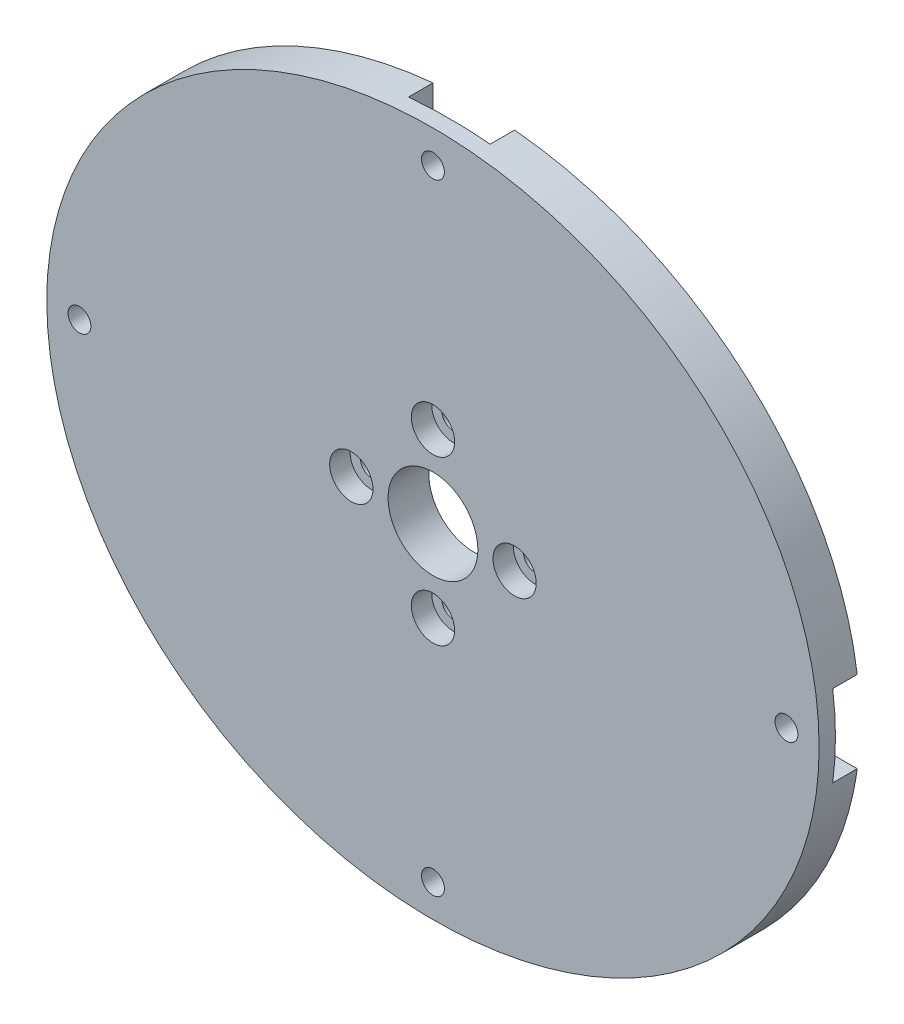
ISO-10303-21;
HEADER;
FILE_DESCRIPTION(('STEP AP214'),'2;1');
FILE_NAME('part.step','',(''),(''),'','','');
FILE_SCHEMA(('AUTOMOTIVE_DESIGN { 1 0 10303 214 1 1 1 1 }'));
ENDSEC;
DATA;
#1=APPLICATION_CONTEXT('core data for automotive mechanical design processes');
#2=APPLICATION_PROTOCOL_DEFINITION('international standard','automotive_design',2000,#1);
#3=PRODUCT_CONTEXT('',#1,'mechanical');
#4=PRODUCT('Part','Part','',(#3));
#5=PRODUCT_RELATED_PRODUCT_CATEGORY('part','',(#4));
#6=PRODUCT_DEFINITION_FORMATION('','',#4);
#7=PRODUCT_DEFINITION_CONTEXT('part definition',#1,'design');
#8=PRODUCT_DEFINITION('design','',#6,#7);
#9=PRODUCT_DEFINITION_SHAPE('','',#8);
#10=(LENGTH_UNIT() NAMED_UNIT(*) SI_UNIT(.MILLI.,.METRE.));
#11=(NAMED_UNIT(*) PLANE_ANGLE_UNIT() SI_UNIT($,.RADIAN.));
#12=(NAMED_UNIT(*) SI_UNIT($,.STERADIAN.) SOLID_ANGLE_UNIT());
#13=UNCERTAINTY_MEASURE_WITH_UNIT(LENGTH_MEASURE(1.E-05),#10,'distance_accuracy_value','');
#14=(GEOMETRIC_REPRESENTATION_CONTEXT(3) GLOBAL_UNCERTAINTY_ASSIGNED_CONTEXT((#13)) GLOBAL_UNIT_ASSIGNED_CONTEXT((#10,
#11,#12)) REPRESENTATION_CONTEXT('',''));
#15=CARTESIAN_POINT('',(0.,0.,0.));
#16=DIRECTION('',(0.,0.,1.));
#17=DIRECTION('',(1.,0.,0.));
#18=AXIS2_PLACEMENT_3D('',#15,#16,#17);
#19=CARTESIAN_POINT('',(0.,38.,5.));
#20=DIRECTION('',(0.,0.,-1.));
#21=DIRECTION('',(-1.,0.,0.));
#22=AXIS2_PLACEMENT_3D('',#19,#20,#21);
#23=CYLINDRICAL_SURFACE('',#22,1.4);
#24=CARTESIAN_POINT('',(0.,38.,5.));
#25=DIRECTION('',(0.,0.,1.));
#26=DIRECTION('',(1.,0.,0.));
#27=AXIS2_PLACEMENT_3D('',#24,#25,#26);
#28=CIRCLE('',#27,1.4);
#29=CARTESIAN_POINT('',(1.4,38.,5.));
#30=VERTEX_POINT('',#29);
#31=EDGE_CURVE('E314',#30,#30,#28,.T.);
#32=ORIENTED_EDGE('',*,*,#31,.T.);
#33=EDGE_LOOP('',(#32));
#34=FACE_BOUND('',#33,.T.);
#35=CARTESIAN_POINT('',(0.,38.,3.));
#36=DIRECTION('',(0.,0.,-1.));
#37=DIRECTION('',(-1.,0.,0.));
#38=AXIS2_PLACEMENT_3D('',#35,#36,#37);
#39=CIRCLE('',#38,1.4);
#40=CARTESIAN_POINT('',(-1.4,38.,3.));
#41=VERTEX_POINT('',#40);
#42=EDGE_CURVE('E349',#41,#41,#39,.T.);
#43=ORIENTED_EDGE('',*,*,#42,.T.);
#44=EDGE_LOOP('',(#43));
#45=FACE_BOUND('',#44,.T.);
#46=ADVANCED_FACE('F46',(#34,#45),#23,.F.);
#47=CARTESIAN_POINT('',(43.3,0.,5.));
#48=DIRECTION('',(0.,0.,-1.));
#49=DIRECTION('',(-1.,0.,0.));
#50=AXIS2_PLACEMENT_3D('',#47,#48,#49);
#51=CYLINDRICAL_SURFACE('',#50,1.4);
#52=CARTESIAN_POINT('',(43.3,0.,5.));
#53=DIRECTION('',(0.,0.,1.));
#54=DIRECTION('',(-1.,0.,0.));
#55=AXIS2_PLACEMENT_3D('',#52,#53,#54);
#56=CIRCLE('',#55,1.4);
#57=CARTESIAN_POINT('',(41.9,0.,5.));
#58=VERTEX_POINT('',#57);
#59=EDGE_CURVE('E311',#58,#58,#56,.T.);
#60=ORIENTED_EDGE('',*,*,#59,.T.);
#61=EDGE_LOOP('',(#60));
#62=FACE_BOUND('',#61,.T.);
#63=CARTESIAN_POINT('',(43.3,0.,3.));
#64=DIRECTION('',(0.,0.,-1.));
#65=DIRECTION('',(-1.,0.,0.));
#66=AXIS2_PLACEMENT_3D('',#63,#64,#65);
#67=CIRCLE('',#66,1.4);
#68=CARTESIAN_POINT('',(41.9,0.,3.));
#69=VERTEX_POINT('',#68);
#70=EDGE_CURVE('E346',#69,#69,#67,.T.);
#71=ORIENTED_EDGE('',*,*,#70,.T.);
#72=EDGE_LOOP('',(#71));
#73=FACE_BOUND('',#72,.T.);
#74=ADVANCED_FACE('F393',(#62,#73),#51,.F.);
#75=CARTESIAN_POINT('',(-10.,0.,5.));
#76=DIRECTION('',(0.,0.,-1.));
#77=DIRECTION('',(-1.,0.,0.));
#78=AXIS2_PLACEMENT_3D('',#75,#76,#77);
#79=CYLINDRICAL_SURFACE('',#78,1.4);
#80=CARTESIAN_POINT('',(-10.,0.,0.));
#81=DIRECTION('',(0.,0.,1.));
#82=DIRECTION('',(1.,0.,0.));
#83=AXIS2_PLACEMENT_3D('',#80,#81,#82);
#84=CIRCLE('',#83,1.4);
#85=CARTESIAN_POINT('',(-8.6,0.,0.));
#86=VERTEX_POINT('',#85);
#87=EDGE_CURVE('E329',#86,#86,#84,.T.);
#88=ORIENTED_EDGE('',*,*,#87,.F.);
#89=EDGE_LOOP('',(#88));
#90=FACE_BOUND('',#89,.T.);
#91=CARTESIAN_POINT('',(-10.,0.,2.5));
#92=DIRECTION('',(0.,0.,1.));
#93=DIRECTION('',(1.,0.,0.));
#94=AXIS2_PLACEMENT_3D('',#91,#92,#93);
#95=CIRCLE('',#94,1.4);
#96=CARTESIAN_POINT('',(-8.6,0.,2.5));
#97=VERTEX_POINT('',#96);
#98=EDGE_CURVE('E298',#97,#97,#95,.T.);
#99=ORIENTED_EDGE('',*,*,#98,.T.);
#100=EDGE_LOOP('',(#99));
#101=FACE_BOUND('',#100,.T.);
#102=ADVANCED_FACE('F400',(#90,#101),#79,.F.);
#103=CARTESIAN_POINT('',(0.,10.,5.));
#104=DIRECTION('',(0.,0.,-1.));
#105=DIRECTION('',(-1.,0.,0.));
#106=AXIS2_PLACEMENT_3D('',#103,#104,#105);
#107=CYLINDRICAL_SURFACE('',#106,1.4);
#108=CARTESIAN_POINT('',(0.,10.,0.));
#109=DIRECTION('',(0.,0.,1.));
#110=DIRECTION('',(1.,0.,0.));
#111=AXIS2_PLACEMENT_3D('',#108,#109,#110);
#112=CIRCLE('',#111,1.4);
#113=CARTESIAN_POINT('',(1.40000000000004,10.,0.));
#114=VERTEX_POINT('',#113);
#115=EDGE_CURVE('E323',#114,#114,#112,.T.);
#116=ORIENTED_EDGE('',*,*,#115,.F.);
#117=EDGE_LOOP('',(#116));
#118=FACE_BOUND('',#117,.T.);
#119=CARTESIAN_POINT('',(0.,10.,2.5));
#120=DIRECTION('',(0.,0.,1.));
#121=DIRECTION('',(1.,0.,0.));
#122=AXIS2_PLACEMENT_3D('',#119,#120,#121);
#123=CIRCLE('',#122,1.4);
#124=CARTESIAN_POINT('',(1.40000000000004,10.,2.5));
#125=VERTEX_POINT('',#124);
#126=EDGE_CURVE('E272',#125,#125,#123,.T.);
#127=ORIENTED_EDGE('',*,*,#126,.T.);
#128=EDGE_LOOP('',(#127));
#129=FACE_BOUND('',#128,.T.);
#130=ADVANCED_FACE('F409',(#118,#129),#107,.F.);
#131=CARTESIAN_POINT('',(10.,0.,5.));
#132=DIRECTION('',(0.,0.,-1.));
#133=DIRECTION('',(-1.,0.,0.));
#134=AXIS2_PLACEMENT_3D('',#131,#132,#133);
#135=CYLINDRICAL_SURFACE('',#134,1.4);
#136=CARTESIAN_POINT('',(10.,0.,0.));
#137=DIRECTION('',(0.,0.,1.));
#138=DIRECTION('',(1.,0.,0.));
#139=AXIS2_PLACEMENT_3D('',#136,#137,#138);
#140=CIRCLE('',#139,1.4);
#141=CARTESIAN_POINT('',(11.4,0.,0.));
#142=VERTEX_POINT('',#141);
#143=EDGE_CURVE('E320',#142,#142,#140,.T.);
#144=ORIENTED_EDGE('',*,*,#143,.F.);
#145=EDGE_LOOP('',(#144));
#146=FACE_BOUND('',#145,.T.);
#147=CARTESIAN_POINT('',(10.,0.,2.5));
#148=DIRECTION('',(0.,0.,1.));
#149=DIRECTION('',(1.,0.,0.));
#150=AXIS2_PLACEMENT_3D('',#147,#148,#149);
#151=CIRCLE('',#150,1.4);
#152=CARTESIAN_POINT('',(11.4,0.,2.5));
#153=VERTEX_POINT('',#152);
#154=EDGE_CURVE('E276',#153,#153,#151,.T.);
#155=ORIENTED_EDGE('',*,*,#154,.T.);
#156=EDGE_LOOP('',(#155));
#157=FACE_BOUND('',#156,.T.);
#158=ADVANCED_FACE('F405',(#146,#157),#135,.F.);
#159=CARTESIAN_POINT('',(-1.04744440165294E-13,-10.,5.));
#160=DIRECTION('',(0.,0.,-1.));
#161=DIRECTION('',(-1.,0.,0.));
#162=AXIS2_PLACEMENT_3D('',#159,#160,#161);
#163=CYLINDRICAL_SURFACE('',#162,1.4);
#164=CARTESIAN_POINT('',(-1.04744440165294E-13,-10.,0.));
#165=DIRECTION('',(0.,0.,1.));
#166=DIRECTION('',(1.,0.,0.));
#167=AXIS2_PLACEMENT_3D('',#164,#165,#166);
#168=CIRCLE('',#167,1.4);
#169=CARTESIAN_POINT('',(1.3999999999999,-10.,0.));
#170=VERTEX_POINT('',#169);
#171=EDGE_CURVE('E317',#170,#170,#168,.T.);
#172=ORIENTED_EDGE('',*,*,#171,.F.);
#173=EDGE_LOOP('',(#172));
#174=FACE_BOUND('',#173,.T.);
#175=CARTESIAN_POINT('',(-1.04744440165294E-13,-10.,2.5));
#176=DIRECTION('',(0.,0.,1.));
#177=DIRECTION('',(1.,0.,0.));
#178=AXIS2_PLACEMENT_3D('',#175,#176,#177);
#179=CIRCLE('',#178,1.4);
#180=CARTESIAN_POINT('',(1.3999999999999,-10.,2.5));
#181=VERTEX_POINT('',#180);
#182=EDGE_CURVE('E289',#181,#181,#179,.T.);
#183=ORIENTED_EDGE('',*,*,#182,.T.);
#184=EDGE_LOOP('',(#183));
#185=FACE_BOUND('',#184,.T.);
#186=ADVANCED_FACE('F371',(#174,#185),#163,.F.);
#187=CARTESIAN_POINT('',(0.,0.,5.));
#188=DIRECTION('',(0.,0.,1.));
#189=DIRECTION('',(1.,0.,0.));
#190=AXIS2_PLACEMENT_3D('',#187,#188,#189);
#191=PLANE('',#190);
#192=CARTESIAN_POINT('',(0.,10.,5.));
#193=DIRECTION('',(0.,0.,1.));
#194=DIRECTION('',(1.,0.,0.));
#195=AXIS2_PLACEMENT_3D('',#192,#193,#194);
#196=CIRCLE('',#195,2.65);
#197=CARTESIAN_POINT('',(2.65000000000004,10.,5.));
#198=VERTEX_POINT('',#197);
#199=EDGE_CURVE('E275',#198,#198,#196,.T.);
#200=ORIENTED_EDGE('',*,*,#199,.F.);
#201=EDGE_LOOP('',(#200));
#202=FACE_BOUND('',#201,.T.);
#203=CARTESIAN_POINT('',(10.,0.,5.));
#204=DIRECTION('',(0.,0.,1.));
#205=DIRECTION('',(1.,0.,0.));
#206=AXIS2_PLACEMENT_3D('',#203,#204,#205);
#207=CIRCLE('',#206,2.65);
#208=CARTESIAN_POINT('',(12.65,0.,5.));
#209=VERTEX_POINT('',#208);
#210=EDGE_CURVE('E283',#209,#209,#207,.T.);
#211=ORIENTED_EDGE('',*,*,#210,.F.);
#212=EDGE_LOOP('',(#211));
#213=FACE_BOUND('',#212,.T.);
#214=CARTESIAN_POINT('',(-1.04744440165294E-13,-10.,5.));
#215=DIRECTION('',(0.,0.,1.));
#216=DIRECTION('',(1.,0.,0.));
#217=AXIS2_PLACEMENT_3D('',#214,#215,#216);
#218=CIRCLE('',#217,2.65);
#219=CARTESIAN_POINT('',(2.6499999999999,-10.,5.));
#220=VERTEX_POINT('',#219);
#221=EDGE_CURVE('E292',#220,#220,#218,.T.);
#222=ORIENTED_EDGE('',*,*,#221,.F.);
#223=EDGE_LOOP('',(#222));
#224=FACE_BOUND('',#223,.T.);
#225=CARTESIAN_POINT('',(-10.,0.,5.));
#226=DIRECTION('',(0.,0.,1.));
#227=DIRECTION('',(1.,0.,0.));
#228=AXIS2_PLACEMENT_3D('',#225,#226,#227);
#229=CIRCLE('',#228,2.65);
#230=CARTESIAN_POINT('',(-7.35,0.,5.));
#231=VERTEX_POINT('',#230);
#232=EDGE_CURVE('E301',#231,#231,#229,.T.);
#233=ORIENTED_EDGE('',*,*,#232,.F.);
#234=EDGE_LOOP('',(#233));
#235=FACE_BOUND('',#234,.T.);
#236=ORIENTED_EDGE('',*,*,#59,.F.);
#237=EDGE_LOOP('',(#236));
#238=FACE_BOUND('',#237,.T.);
#239=CARTESIAN_POINT('',(0.,0.,5.));
#240=DIRECTION('',(0.,0.,1.));
#241=DIRECTION('',(-1.,0.,0.));
#242=AXIS2_PLACEMENT_3D('',#239,#240,#241);
#243=ELLIPSE('',#242,47.3,42.);
#244=CARTESIAN_POINT('',(-47.3,0.,5.));
#245=VERTEX_POINT('',#244);
#246=EDGE_CURVE('E12',#245,#245,#243,.T.);
#247=ORIENTED_EDGE('',*,*,#246,.T.);
#248=EDGE_LOOP('',(#247));
#249=FACE_BOUND('',#248,.T.);
#250=CARTESIAN_POINT('',(0.,0.,5.));
#251=DIRECTION('',(0.,0.,1.));
#252=DIRECTION('',(1.,0.,0.));
#253=AXIS2_PLACEMENT_3D('',#250,#251,#252);
#254=CIRCLE('',#253,5.5);
#255=CARTESIAN_POINT('',(5.5,0.,5.));
#256=VERTEX_POINT('',#255);
#257=EDGE_CURVE('E333',#256,#256,#254,.T.);
#258=ORIENTED_EDGE('',*,*,#257,.F.);
#259=EDGE_LOOP('',(#258));
#260=FACE_BOUND('',#259,.T.);
#261=CARTESIAN_POINT('',(-43.3,0.,5.));
#262=DIRECTION('',(0.,0.,1.));
#263=DIRECTION('',(1.,0.,0.));
#264=AXIS2_PLACEMENT_3D('',#261,#262,#263);
#265=CIRCLE('',#264,1.4);
#266=CARTESIAN_POINT('',(-41.9,0.,5.));
#267=VERTEX_POINT('',#266);
#268=EDGE_CURVE('E326',#267,#267,#265,.T.);
#269=ORIENTED_EDGE('',*,*,#268,.F.);
#270=EDGE_LOOP('',(#269));
#271=FACE_BOUND('',#270,.T.);
#272=ORIENTED_EDGE('',*,*,#31,.F.);
#273=EDGE_LOOP('',(#272));
#274=FACE_BOUND('',#273,.T.);
#275=CARTESIAN_POINT('',(0.,-38.,5.));
#276=DIRECTION('',(0.,0.,1.));
#277=DIRECTION('',(-1.,0.,0.));
#278=AXIS2_PLACEMENT_3D('',#275,#276,#277);
#279=CIRCLE('',#278,1.4);
#280=CARTESIAN_POINT('',(-1.4,-38.,5.));
#281=VERTEX_POINT('',#280);
#282=EDGE_CURVE('E280',#281,#281,#279,.T.);
#283=ORIENTED_EDGE('',*,*,#282,.F.);
#284=EDGE_LOOP('',(#283));
#285=FACE_BOUND('',#284,.T.);
#286=ADVANCED_FACE('F367',(#202,#213,#224,#235,#238,#249,#260,#271,#274,#285),#191,.T.);
#287=CARTESIAN_POINT('',(0.,0.,0.));
#288=DIRECTION('',(0.,0.,1.));
#289=DIRECTION('',(1.,0.,0.));
#290=AXIS2_PLACEMENT_3D('',#287,#288,#289);
#291=PLANE('',#290);
#292=CARTESIAN_POINT('',(0.,0.,0.));
#293=DIRECTION('',(0.,0.,1.));
#294=DIRECTION('',(-1.,0.,0.));
#295=AXIS2_PLACEMENT_3D('',#292,#293,#294);
#296=ELLIPSE('',#295,47.3,42.);
#297=CARTESIAN_POINT('',(-4.99999999999998,41.7646818830188,0.));
#298=VERTEX_POINT('',#297);
#299=CARTESIAN_POINT('',(-46.9636282167748,5.00000000000043,0.));
#300=VERTEX_POINT('',#299);
#301=EDGE_CURVE('E336',#298,#300,#296,.T.);
#302=ORIENTED_EDGE('',*,*,#301,.F.);
#303=DIRECTION('',(0.,1.,0.));
#304=VECTOR('',#303,1.);
#305=CARTESIAN_POINT('',(-4.99999999999999,31.7646818830188,0.));
#306=LINE('',#305,#304);
#307=CARTESIAN_POINT('',(-4.99999999999999,31.7646818830188,0.));
#308=VERTEX_POINT('',#307);
#309=EDGE_CURVE('E179',#308,#298,#306,.T.);
#310=ORIENTED_EDGE('',*,*,#309,.F.);
#311=DIRECTION('',(-1.,0.,0.));
#312=VECTOR('',#311,1.);
#313=CARTESIAN_POINT('',(5.00000000000001,31.7646818830188,0.));
#314=LINE('',#313,#312);
#315=CARTESIAN_POINT('',(5.00000000000001,31.7646818830188,0.));
#316=VERTEX_POINT('',#315);
#317=EDGE_CURVE('E488',#316,#308,#314,.T.);
#318=ORIENTED_EDGE('',*,*,#317,.F.);
#319=DIRECTION('',(0.,-1.,0.));
#320=VECTOR('',#319,1.);
#321=CARTESIAN_POINT('',(4.99999999999999,41.7646818830188,0.));
#322=LINE('',#321,#320);
#323=CARTESIAN_POINT('',(4.99999999999999,41.7646818830188,0.));
#324=VERTEX_POINT('',#323);
#325=EDGE_CURVE('E209',#324,#316,#322,.T.);
#326=ORIENTED_EDGE('',*,*,#325,.F.);
#327=CARTESIAN_POINT('',(46.9636282167748,4.99999999999998,0.));
#328=VERTEX_POINT('',#327);
#329=EDGE_CURVE('E184',#328,#324,#296,.T.);
#330=ORIENTED_EDGE('',*,*,#329,.F.);
#331=DIRECTION('',(1.,0.,0.));
#332=VECTOR('',#331,1.);
#333=CARTESIAN_POINT('',(46.9636282167748,4.99999999999998,0.));
#334=LINE('',#333,#332);
#335=CARTESIAN_POINT('',(36.9636282167748,4.99999999999998,0.));
#336=VERTEX_POINT('',#335);
#337=EDGE_CURVE('E200',#336,#328,#334,.T.);
#338=ORIENTED_EDGE('',*,*,#337,.F.);
#339=DIRECTION('',(0.,1.,0.));
#340=VECTOR('',#339,1.);
#341=CARTESIAN_POINT('',(36.9636282167748,4.99999999999998,0.));
#342=LINE('',#341,#340);
#343=CARTESIAN_POINT('',(36.9636282167748,-5.00000000000002,0.));
#344=VERTEX_POINT('',#343);
#345=EDGE_CURVE('E202',#344,#336,#342,.T.);
#346=ORIENTED_EDGE('',*,*,#345,.F.);
#347=DIRECTION('',(-1.,0.,0.));
#348=VECTOR('',#347,1.);
#349=CARTESIAN_POINT('',(36.9636282167748,-5.00000000000002,0.));
#350=LINE('',#349,#348);
#351=CARTESIAN_POINT('',(46.9636282167748,-5.00000000000002,0.));
#352=VERTEX_POINT('',#351);
#353=EDGE_CURVE('E206',#352,#344,#350,.T.);
#354=ORIENTED_EDGE('',*,*,#353,.F.);
#355=CARTESIAN_POINT('',(4.99999999999999,-41.7646818830188,0.));
#356=VERTEX_POINT('',#355);
#357=EDGE_CURVE('E342',#356,#352,#296,.T.);
#358=ORIENTED_EDGE('',*,*,#357,.F.);
#359=DIRECTION('',(0.,-1.,0.));
#360=VECTOR('',#359,1.);
#361=CARTESIAN_POINT('',(4.99999999999999,-41.7646818830188,0.));
#362=LINE('',#361,#360);
#363=CARTESIAN_POINT('',(5.00000000000001,-31.7646818830188,0.));
#364=VERTEX_POINT('',#363);
#365=EDGE_CURVE('E255',#364,#356,#362,.T.);
#366=ORIENTED_EDGE('',*,*,#365,.F.);
#367=DIRECTION('',(1.,0.,0.));
#368=VECTOR('',#367,1.);
#369=CARTESIAN_POINT('',(5.00000000000001,-31.7646818830188,0.));
#370=LINE('',#369,#368);
#371=CARTESIAN_POINT('',(-4.99999999999999,-31.7646818830188,0.));
#372=VERTEX_POINT('',#371);
#373=EDGE_CURVE('E257',#372,#364,#370,.T.);
#374=ORIENTED_EDGE('',*,*,#373,.F.);
#375=DIRECTION('',(0.,1.,0.));
#376=VECTOR('',#375,1.);
#377=CARTESIAN_POINT('',(-4.99999999999999,-31.7646818830188,0.));
#378=LINE('',#377,#376);
#379=CARTESIAN_POINT('',(-4.99999999999998,-41.7646818830188,0.));
#380=VERTEX_POINT('',#379);
#381=EDGE_CURVE('E227',#380,#372,#378,.T.);
#382=ORIENTED_EDGE('',*,*,#381,.F.);
#383=CARTESIAN_POINT('',(-46.9636282167748,-4.99999999999979,0.));
#384=VERTEX_POINT('',#383);
#385=EDGE_CURVE('E56',#384,#380,#296,.T.);
#386=ORIENTED_EDGE('',*,*,#385,.F.);
#387=DIRECTION('',(-1.,0.,0.));
#388=VECTOR('',#387,1.);
#389=CARTESIAN_POINT('',(-36.9636282167748,-4.99999999999979,0.));
#390=LINE('',#389,#388);
#391=CARTESIAN_POINT('',(-36.9636282167748,-4.99999999999979,0.));
#392=VERTEX_POINT('',#391);
#393=EDGE_CURVE('E228',#392,#384,#390,.T.);
#394=ORIENTED_EDGE('',*,*,#393,.F.);
#395=DIRECTION('',(0.,-1.,0.));
#396=VECTOR('',#395,1.);
#397=CARTESIAN_POINT('',(-36.9636282167748,5.00000000000043,0.));
#398=LINE('',#397,#396);
#399=CARTESIAN_POINT('',(-36.9636282167748,5.00000000000043,0.));
#400=VERTEX_POINT('',#399);
#401=EDGE_CURVE('E230',#400,#392,#398,.T.);
#402=ORIENTED_EDGE('',*,*,#401,.F.);
#403=DIRECTION('',(1.,0.,0.));
#404=VECTOR('',#403,1.);
#405=CARTESIAN_POINT('',(-46.9636282167748,5.00000000000043,0.));
#406=LINE('',#405,#404);
#407=EDGE_CURVE('E199',#300,#400,#406,.T.);
#408=ORIENTED_EDGE('',*,*,#407,.F.);
#409=EDGE_LOOP('',(#302,#310,#318,#326,#330,#338,#346,#354,#358,#366,#374,#382,#386,#394,#402,#408));
#410=FACE_BOUND('',#409,.T.);
#411=CARTESIAN_POINT('',(0.,0.,0.));
#412=DIRECTION('',(0.,0.,1.));
#413=DIRECTION('',(1.,0.,0.));
#414=AXIS2_PLACEMENT_3D('',#411,#412,#413);
#415=CIRCLE('',#414,5.5);
#416=CARTESIAN_POINT('',(5.5,0.,0.));
#417=VERTEX_POINT('',#416);
#418=EDGE_CURVE('E332',#417,#417,#415,.T.);
#419=ORIENTED_EDGE('',*,*,#418,.T.);
#420=EDGE_LOOP('',(#419));
#421=FACE_BOUND('',#420,.T.);
#422=ORIENTED_EDGE('',*,*,#87,.T.);
#423=EDGE_LOOP('',(#422));
#424=FACE_BOUND('',#423,.T.);
#425=ORIENTED_EDGE('',*,*,#115,.T.);
#426=EDGE_LOOP('',(#425));
#427=FACE_BOUND('',#426,.T.);
#428=ORIENTED_EDGE('',*,*,#143,.T.);
#429=EDGE_LOOP('',(#428));
#430=FACE_BOUND('',#429,.T.);
#431=ORIENTED_EDGE('',*,*,#171,.T.);
#432=EDGE_LOOP('',(#431));
#433=FACE_BOUND('',#432,.T.);
#434=ADVANCED_FACE('F370',(#410,#421,#424,#427,#430,#433),#291,.F.);
#435=DIRECTION('',(0.,0.,-1.));
#436=VECTOR('',#435,1.);
#437=SURFACE_OF_LINEAR_EXTRUSION('',#243,#436);
#438=ORIENTED_EDGE('',*,*,#246,.F.);
#439=EDGE_LOOP('',(#438));
#440=FACE_BOUND('',#439,.T.);
#441=CARTESIAN_POINT('',(0.,0.,3.));
#442=DIRECTION('',(0.,0.,-1.));
#443=DIRECTION('',(-1.,0.,0.));
#444=AXIS2_PLACEMENT_3D('',#441,#442,#443);
#445=ELLIPSE('',#444,47.3,42.);
#446=CARTESIAN_POINT('',(-4.99999999999997,41.7646818830188,3.));
#447=VERTEX_POINT('',#446);
#448=CARTESIAN_POINT('',(4.99999999999999,41.7646818830188,3.));
#449=VERTEX_POINT('',#448);
#450=EDGE_CURVE('E173',#447,#449,#445,.T.);
#451=ORIENTED_EDGE('',*,*,#450,.F.);
#452=DIRECTION('',(0.,0.,-1.));
#453=VECTOR('',#452,1.);
#454=CARTESIAN_POINT('',(-4.99999999999998,41.7646818830188,3.));
#455=LINE('',#454,#453);
#456=EDGE_CURVE('E347',#447,#298,#455,.T.);
#457=ORIENTED_EDGE('',*,*,#456,.T.);
#458=ORIENTED_EDGE('',*,*,#301,.T.);
#459=DIRECTION('',(0.,0.,-1.));
#460=VECTOR('',#459,1.);
#461=CARTESIAN_POINT('',(-46.9636282167748,5.00000000000043,3.));
#462=LINE('',#461,#460);
#463=CARTESIAN_POINT('',(-46.9636282167748,5.00000000000043,3.));
#464=VERTEX_POINT('',#463);
#465=EDGE_CURVE('E217',#464,#300,#462,.T.);
#466=ORIENTED_EDGE('',*,*,#465,.F.);
#467=CARTESIAN_POINT('',(0.,0.,3.));
#468=DIRECTION('',(0.,0.,-1.));
#469=DIRECTION('',(1.,0.,0.));
#470=AXIS2_PLACEMENT_3D('',#467,#468,#469);
#471=ELLIPSE('',#470,47.3,42.);
#472=CARTESIAN_POINT('',(-46.9636282167748,-4.99999999999979,3.));
#473=VERTEX_POINT('',#472);
#474=EDGE_CURVE('E231',#473,#464,#471,.T.);
#475=ORIENTED_EDGE('',*,*,#474,.F.);
#476=DIRECTION('',(0.,0.,-1.));
#477=VECTOR('',#476,1.);
#478=CARTESIAN_POINT('',(-46.9636282167748,-4.99999999999979,3.));
#479=LINE('',#478,#477);
#480=EDGE_CURVE('E224',#473,#384,#479,.T.);
#481=ORIENTED_EDGE('',*,*,#480,.T.);
#482=ORIENTED_EDGE('',*,*,#385,.T.);
#483=DIRECTION('',(0.,0.,-1.));
#484=VECTOR('',#483,1.);
#485=CARTESIAN_POINT('',(-4.99999999999998,-41.7646818830188,3.));
#486=LINE('',#485,#484);
#487=CARTESIAN_POINT('',(-4.99999999999998,-41.7646818830188,3.));
#488=VERTEX_POINT('',#487);
#489=EDGE_CURVE('E245',#488,#380,#486,.T.);
#490=ORIENTED_EDGE('',*,*,#489,.F.);
#491=CARTESIAN_POINT('',(0.,0.,3.));
#492=DIRECTION('',(0.,0.,-1.));
#493=DIRECTION('',(-1.,0.,0.));
#494=AXIS2_PLACEMENT_3D('',#491,#492,#493);
#495=ELLIPSE('',#494,47.3,42.);
#496=CARTESIAN_POINT('',(4.99999999999999,-41.7646818830188,3.));
#497=VERTEX_POINT('',#496);
#498=EDGE_CURVE('E258',#497,#488,#495,.T.);
#499=ORIENTED_EDGE('',*,*,#498,.F.);
#500=DIRECTION('',(0.,0.,-1.));
#501=VECTOR('',#500,1.);
#502=CARTESIAN_POINT('',(4.99999999999999,-41.7646818830188,3.));
#503=LINE('',#502,#501);
#504=EDGE_CURVE('E252',#497,#356,#503,.T.);
#505=ORIENTED_EDGE('',*,*,#504,.T.);
#506=ORIENTED_EDGE('',*,*,#357,.T.);
#507=DIRECTION('',(0.,0.,-1.));
#508=VECTOR('',#507,1.);
#509=CARTESIAN_POINT('',(46.9636282167748,-5.00000000000002,3.));
#510=LINE('',#509,#508);
#511=CARTESIAN_POINT('',(46.9636282167748,-5.00000000000002,3.));
#512=VERTEX_POINT('',#511);
#513=EDGE_CURVE('E191',#512,#352,#510,.T.);
#514=ORIENTED_EDGE('',*,*,#513,.F.);
#515=CARTESIAN_POINT('',(0.,0.,3.));
#516=DIRECTION('',(0.,0.,-1.));
#517=DIRECTION('',(-1.,0.,0.));
#518=AXIS2_PLACEMENT_3D('',#515,#516,#517);
#519=ELLIPSE('',#518,47.3,42.);
#520=CARTESIAN_POINT('',(46.9636282167748,4.99999999999998,3.));
#521=VERTEX_POINT('',#520);
#522=EDGE_CURVE('E203',#521,#512,#519,.T.);
#523=ORIENTED_EDGE('',*,*,#522,.F.);
#524=DIRECTION('',(0.,0.,-1.));
#525=VECTOR('',#524,1.);
#526=CARTESIAN_POINT('',(46.9636282167748,4.99999999999998,3.));
#527=LINE('',#526,#525);
#528=EDGE_CURVE('E197',#521,#328,#527,.T.);
#529=ORIENTED_EDGE('',*,*,#528,.T.);
#530=ORIENTED_EDGE('',*,*,#329,.T.);
#531=DIRECTION('',(0.,0.,-1.));
#532=VECTOR('',#531,1.);
#533=CARTESIAN_POINT('',(4.99999999999999,41.7646818830188,3.));
#534=LINE('',#533,#532);
#535=EDGE_CURVE('E168',#449,#324,#534,.T.);
#536=ORIENTED_EDGE('',*,*,#535,.F.);
#537=EDGE_LOOP('',(#451,#457,#458,#466,#475,#481,#482,#490,#499,#505,#506,#514,#523,#529,#530,#536));
#538=FACE_BOUND('',#537,.T.);
#539=ADVANCED_FACE('F48',(#440,#538),#437,.F.);
#540=CARTESIAN_POINT('',(0.,0.,5.));
#541=DIRECTION('',(0.,0.,-1.));
#542=DIRECTION('',(-1.,0.,0.));
#543=AXIS2_PLACEMENT_3D('',#540,#541,#542);
#544=CYLINDRICAL_SURFACE('',#543,5.5);
#545=ORIENTED_EDGE('',*,*,#257,.T.);
#546=EDGE_LOOP('',(#545));
#547=FACE_BOUND('',#546,.T.);
#548=ORIENTED_EDGE('',*,*,#418,.F.);
#549=EDGE_LOOP('',(#548));
#550=FACE_BOUND('',#549,.T.);
#551=ADVANCED_FACE('F363',(#547,#550),#544,.F.);
#552=CARTESIAN_POINT('',(-43.3,0.,5.));
#553=DIRECTION('',(0.,0.,-1.));
#554=DIRECTION('',(-1.,0.,0.));
#555=AXIS2_PLACEMENT_3D('',#552,#553,#554);
#556=CYLINDRICAL_SURFACE('',#555,1.4);
#557=CARTESIAN_POINT('',(-43.3,0.,3.));
#558=DIRECTION('',(0.,0.,1.));
#559=DIRECTION('',(1.,0.,0.));
#560=AXIS2_PLACEMENT_3D('',#557,#558,#559);
#561=CIRCLE('',#560,1.4);
#562=CARTESIAN_POINT('',(-41.9,0.,3.));
#563=VERTEX_POINT('',#562);
#564=EDGE_CURVE('E51',#563,#563,#561,.T.);
#565=ORIENTED_EDGE('',*,*,#564,.F.);
#566=EDGE_LOOP('',(#565));
#567=FACE_BOUND('',#566,.T.);
#568=ORIENTED_EDGE('',*,*,#268,.T.);
#569=EDGE_LOOP('',(#568));
#570=FACE_BOUND('',#569,.T.);
#571=ADVANCED_FACE('F359',(#567,#570),#556,.F.);
#572=CARTESIAN_POINT('',(0.,-38.,5.));
#573=DIRECTION('',(0.,0.,-1.));
#574=DIRECTION('',(-1.,0.,0.));
#575=AXIS2_PLACEMENT_3D('',#572,#573,#574);
#576=CYLINDRICAL_SURFACE('',#575,1.4);
#577=CARTESIAN_POINT('',(0.,-38.,3.));
#578=DIRECTION('',(0.,0.,1.));
#579=DIRECTION('',(1.,0.,0.));
#580=AXIS2_PLACEMENT_3D('',#577,#578,#579);
#581=CIRCLE('',#580,1.4);
#582=CARTESIAN_POINT('',(1.4,-38.,3.));
#583=VERTEX_POINT('',#582);
#584=EDGE_CURVE('E343',#583,#583,#581,.T.);
#585=ORIENTED_EDGE('',*,*,#584,.F.);
#586=EDGE_LOOP('',(#585));
#587=FACE_BOUND('',#586,.T.);
#588=ORIENTED_EDGE('',*,*,#282,.T.);
#589=EDGE_LOOP('',(#588));
#590=FACE_BOUND('',#589,.T.);
#591=ADVANCED_FACE('F362',(#587,#590),#576,.F.);
#592=CARTESIAN_POINT('',(-1.04744440165294E-13,-10.,2.5));
#593=DIRECTION('',(0.,0.,1.));
#594=DIRECTION('',(1.,0.,0.));
#595=AXIS2_PLACEMENT_3D('',#592,#593,#594);
#596=CYLINDRICAL_SURFACE('',#595,2.65);
#597=CARTESIAN_POINT('',(-1.04744440165294E-13,-10.,2.5));
#598=DIRECTION('',(0.,0.,1.));
#599=DIRECTION('',(1.,0.,0.));
#600=AXIS2_PLACEMENT_3D('',#597,#598,#599);
#601=CIRCLE('',#600,2.65);
#602=CARTESIAN_POINT('',(2.6499999999999,-10.,2.5));
#603=VERTEX_POINT('',#602);
#604=EDGE_CURVE('E295',#603,#603,#601,.T.);
#605=ORIENTED_EDGE('',*,*,#604,.F.);
#606=EDGE_LOOP('',(#605));
#607=FACE_BOUND('',#606,.T.);
#608=ORIENTED_EDGE('',*,*,#221,.T.);
#609=EDGE_LOOP('',(#608));
#610=FACE_BOUND('',#609,.T.);
#611=ADVANCED_FACE('F379',(#607,#610),#596,.F.);
#612=CARTESIAN_POINT('',(-1.04744440165294E-13,-10.,2.5));
#613=DIRECTION('',(0.,0.,1.));
#614=DIRECTION('',(1.,0.,0.));
#615=AXIS2_PLACEMENT_3D('',#612,#613,#614);
#616=PLANE('',#615);
#617=ORIENTED_EDGE('',*,*,#182,.F.);
#618=EDGE_LOOP('',(#617));
#619=FACE_BOUND('',#618,.T.);
#620=ORIENTED_EDGE('',*,*,#604,.T.);
#621=EDGE_LOOP('',(#620));
#622=FACE_BOUND('',#621,.T.);
#623=ADVANCED_FACE('F386',(#619,#622),#616,.T.);
#624=CARTESIAN_POINT('',(10.,0.,2.5));
#625=DIRECTION('',(0.,0.,1.));
#626=DIRECTION('',(1.,0.,0.));
#627=AXIS2_PLACEMENT_3D('',#624,#625,#626);
#628=CYLINDRICAL_SURFACE('',#627,2.65);
#629=CARTESIAN_POINT('',(10.,0.,2.5));
#630=DIRECTION('',(0.,0.,1.));
#631=DIRECTION('',(1.,0.,0.));
#632=AXIS2_PLACEMENT_3D('',#629,#630,#631);
#633=CIRCLE('',#632,2.65);
#634=CARTESIAN_POINT('',(12.65,0.,2.5));
#635=VERTEX_POINT('',#634);
#636=EDGE_CURVE('E286',#635,#635,#633,.T.);
#637=ORIENTED_EDGE('',*,*,#636,.F.);
#638=EDGE_LOOP('',(#637));
#639=FACE_BOUND('',#638,.T.);
#640=ORIENTED_EDGE('',*,*,#210,.T.);
#641=EDGE_LOOP('',(#640));
#642=FACE_BOUND('',#641,.T.);
#643=ADVANCED_FACE('F444',(#639,#642),#628,.F.);
#644=CARTESIAN_POINT('',(10.,0.,2.5));
#645=DIRECTION('',(0.,0.,1.));
#646=DIRECTION('',(1.,0.,0.));
#647=AXIS2_PLACEMENT_3D('',#644,#645,#646);
#648=PLANE('',#647);
#649=ORIENTED_EDGE('',*,*,#154,.F.);
#650=EDGE_LOOP('',(#649));
#651=FACE_BOUND('',#650,.T.);
#652=ORIENTED_EDGE('',*,*,#636,.T.);
#653=EDGE_LOOP('',(#652));
#654=FACE_BOUND('',#653,.T.);
#655=ADVANCED_FACE('F548',(#651,#654),#648,.T.);
#656=CARTESIAN_POINT('',(0.,10.,2.5));
#657=DIRECTION('',(0.,0.,1.));
#658=DIRECTION('',(1.,0.,0.));
#659=AXIS2_PLACEMENT_3D('',#656,#657,#658);
#660=CYLINDRICAL_SURFACE('',#659,2.65);
#661=CARTESIAN_POINT('',(0.,10.,2.5));
#662=DIRECTION('',(0.,0.,1.));
#663=DIRECTION('',(1.,0.,0.));
#664=AXIS2_PLACEMENT_3D('',#661,#662,#663);
#665=CIRCLE('',#664,2.65);
#666=CARTESIAN_POINT('',(2.65000000000004,10.,2.5));
#667=VERTEX_POINT('',#666);
#668=EDGE_CURVE('E277',#667,#667,#665,.T.);
#669=ORIENTED_EDGE('',*,*,#668,.F.);
#670=EDGE_LOOP('',(#669));
#671=FACE_BOUND('',#670,.T.);
#672=ORIENTED_EDGE('',*,*,#199,.T.);
#673=EDGE_LOOP('',(#672));
#674=FACE_BOUND('',#673,.T.);
#675=ADVANCED_FACE('F544',(#671,#674),#660,.F.);
#676=CARTESIAN_POINT('',(0.,10.,2.5));
#677=DIRECTION('',(0.,0.,1.));
#678=DIRECTION('',(1.,0.,0.));
#679=AXIS2_PLACEMENT_3D('',#676,#677,#678);
#680=PLANE('',#679);
#681=ORIENTED_EDGE('',*,*,#126,.F.);
#682=EDGE_LOOP('',(#681));
#683=FACE_BOUND('',#682,.T.);
#684=ORIENTED_EDGE('',*,*,#668,.T.);
#685=EDGE_LOOP('',(#684));
#686=FACE_BOUND('',#685,.T.);
#687=ADVANCED_FACE('F540',(#683,#686),#680,.T.);
#688=CARTESIAN_POINT('',(-10.,0.,2.5));
#689=DIRECTION('',(0.,0.,1.));
#690=DIRECTION('',(1.,0.,0.));
#691=AXIS2_PLACEMENT_3D('',#688,#689,#690);
#692=CYLINDRICAL_SURFACE('',#691,2.65);
#693=CARTESIAN_POINT('',(-10.,0.,2.5));
#694=DIRECTION('',(0.,0.,1.));
#695=DIRECTION('',(1.,0.,0.));
#696=AXIS2_PLACEMENT_3D('',#693,#694,#695);
#697=CIRCLE('',#696,2.65);
#698=CARTESIAN_POINT('',(-7.35,0.,2.5));
#699=VERTEX_POINT('',#698);
#700=EDGE_CURVE('E304',#699,#699,#697,.T.);
#701=ORIENTED_EDGE('',*,*,#700,.F.);
#702=EDGE_LOOP('',(#701));
#703=FACE_BOUND('',#702,.T.);
#704=ORIENTED_EDGE('',*,*,#232,.T.);
#705=EDGE_LOOP('',(#704));
#706=FACE_BOUND('',#705,.T.);
#707=ADVANCED_FACE('F543',(#703,#706),#692,.F.);
#708=CARTESIAN_POINT('',(-10.,0.,2.5));
#709=DIRECTION('',(0.,0.,1.));
#710=DIRECTION('',(1.,0.,0.));
#711=AXIS2_PLACEMENT_3D('',#708,#709,#710);
#712=PLANE('',#711);
#713=ORIENTED_EDGE('',*,*,#98,.F.);
#714=EDGE_LOOP('',(#713));
#715=FACE_BOUND('',#714,.T.);
#716=ORIENTED_EDGE('',*,*,#700,.T.);
#717=EDGE_LOOP('',(#716));
#718=FACE_BOUND('',#717,.T.);
#719=ADVANCED_FACE('F535',(#715,#718),#712,.T.);
#720=CARTESIAN_POINT('',(4.99999999999999,-41.7646818830188,3.));
#721=DIRECTION('',(1.,0.,0.));
#722=DIRECTION('',(0.,1.,0.));
#723=AXIS2_PLACEMENT_3D('',#720,#721,#722);
#724=PLANE('',#723);
#725=ORIENTED_EDGE('',*,*,#365,.T.);
#726=ORIENTED_EDGE('',*,*,#504,.F.);
#727=DIRECTION('',(0.,-1.,0.));
#728=VECTOR('',#727,1.);
#729=CARTESIAN_POINT('',(4.99999999999999,-41.7646818830188,3.));
#730=LINE('',#729,#728);
#731=CARTESIAN_POINT('',(5.00000000000001,-31.7646818830188,3.));
#732=VERTEX_POINT('',#731);
#733=EDGE_CURVE('E247',#732,#497,#730,.T.);
#734=ORIENTED_EDGE('',*,*,#733,.F.);
#735=DIRECTION('',(0.,0.,-1.));
#736=VECTOR('',#735,1.);
#737=CARTESIAN_POINT('',(5.00000000000001,-31.7646818830188,3.));
#738=LINE('',#737,#736);
#739=EDGE_CURVE('E250',#732,#364,#738,.T.);
#740=ORIENTED_EDGE('',*,*,#739,.T.);
#741=EDGE_LOOP('',(#725,#726,#734,#740));
#742=FACE_BOUND('',#741,.T.);
#743=ADVANCED_FACE('F532',(#742),#724,.F.);
#744=CARTESIAN_POINT('',(5.00000000000001,-31.7646818830188,3.));
#745=DIRECTION('',(0.,1.,0.));
#746=DIRECTION('',(0.,0.,1.));
#747=AXIS2_PLACEMENT_3D('',#744,#745,#746);
#748=PLANE('',#747);
#749=ORIENTED_EDGE('',*,*,#373,.T.);
#750=ORIENTED_EDGE('',*,*,#739,.F.);
#751=DIRECTION('',(1.,0.,0.));
#752=VECTOR('',#751,1.);
#753=CARTESIAN_POINT('',(5.00000000000001,-31.7646818830188,3.));
#754=LINE('',#753,#752);
#755=CARTESIAN_POINT('',(-4.99999999999999,-31.7646818830188,3.));
#756=VERTEX_POINT('',#755);
#757=EDGE_CURVE('E264',#756,#732,#754,.T.);
#758=ORIENTED_EDGE('',*,*,#757,.F.);
#759=DIRECTION('',(0.,0.,-1.));
#760=VECTOR('',#759,1.);
#761=CARTESIAN_POINT('',(-4.99999999999999,-31.7646818830188,3.));
#762=LINE('',#761,#760);
#763=EDGE_CURVE('E248',#756,#372,#762,.T.);
#764=ORIENTED_EDGE('',*,*,#763,.T.);
#765=EDGE_LOOP('',(#749,#750,#758,#764));
#766=FACE_BOUND('',#765,.T.);
#767=ADVANCED_FACE('F528',(#766),#748,.F.);
#768=CARTESIAN_POINT('',(-4.99999999999999,-31.7646818830188,3.));
#769=DIRECTION('',(-1.,0.,0.));
#770=DIRECTION('',(0.,-1.,0.));
#771=AXIS2_PLACEMENT_3D('',#768,#769,#770);
#772=PLANE('',#771);
#773=ORIENTED_EDGE('',*,*,#381,.T.);
#774=ORIENTED_EDGE('',*,*,#763,.F.);
#775=DIRECTION('',(0.,1.,0.));
#776=VECTOR('',#775,1.);
#777=CARTESIAN_POINT('',(-4.99999999999999,-31.7646818830188,3.));
#778=LINE('',#777,#776);
#779=EDGE_CURVE('E267',#488,#756,#778,.T.);
#780=ORIENTED_EDGE('',*,*,#779,.F.);
#781=ORIENTED_EDGE('',*,*,#489,.T.);
#782=EDGE_LOOP('',(#773,#774,#780,#781));
#783=FACE_BOUND('',#782,.T.);
#784=ADVANCED_FACE('F525',(#783),#772,.F.);
#785=CARTESIAN_POINT('',(0.,0.,3.));
#786=DIRECTION('',(0.,0.,1.));
#787=DIRECTION('',(1.,0.,0.));
#788=AXIS2_PLACEMENT_3D('',#785,#786,#787);
#789=PLANE('',#788);
#790=ORIENTED_EDGE('',*,*,#584,.T.);
#791=EDGE_LOOP('',(#790));
#792=FACE_BOUND('',#791,.T.);
#793=ORIENTED_EDGE('',*,*,#498,.T.);
#794=ORIENTED_EDGE('',*,*,#779,.T.);
#795=ORIENTED_EDGE('',*,*,#757,.T.);
#796=ORIENTED_EDGE('',*,*,#733,.T.);
#797=EDGE_LOOP('',(#793,#794,#795,#796));
#798=FACE_BOUND('',#797,.T.);
#799=ADVANCED_FACE('F509',(#792,#798),#789,.F.);
#800=CARTESIAN_POINT('',(46.9636282167748,4.99999999999998,3.));
#801=DIRECTION('',(0.,1.,0.));
#802=DIRECTION('',(-1.,0.,0.));
#803=AXIS2_PLACEMENT_3D('',#800,#801,#802);
#804=PLANE('',#803);
#805=ORIENTED_EDGE('',*,*,#337,.T.);
#806=ORIENTED_EDGE('',*,*,#528,.F.);
#807=DIRECTION('',(1.,0.,0.));
#808=VECTOR('',#807,1.);
#809=CARTESIAN_POINT('',(46.9636282167748,4.99999999999998,3.));
#810=LINE('',#809,#808);
#811=CARTESIAN_POINT('',(36.9636282167748,4.99999999999998,3.));
#812=VERTEX_POINT('',#811);
#813=EDGE_CURVE('E71',#812,#521,#810,.T.);
#814=ORIENTED_EDGE('',*,*,#813,.F.);
#815=DIRECTION('',(0.,0.,-1.));
#816=VECTOR('',#815,1.);
#817=CARTESIAN_POINT('',(36.9636282167748,4.99999999999998,3.));
#818=LINE('',#817,#816);
#819=EDGE_CURVE('E195',#812,#336,#818,.T.);
#820=ORIENTED_EDGE('',*,*,#819,.T.);
#821=EDGE_LOOP('',(#805,#806,#814,#820));
#822=FACE_BOUND('',#821,.T.);
#823=ADVANCED_FACE('F480',(#822),#804,.F.);
#824=CARTESIAN_POINT('',(36.9636282167748,4.99999999999998,3.));
#825=DIRECTION('',(-1.,0.,0.));
#826=DIRECTION('',(0.,0.,1.));
#827=AXIS2_PLACEMENT_3D('',#824,#825,#826);
#828=PLANE('',#827);
#829=ORIENTED_EDGE('',*,*,#345,.T.);
#830=ORIENTED_EDGE('',*,*,#819,.F.);
#831=DIRECTION('',(0.,1.,0.));
#832=VECTOR('',#831,1.);
#833=CARTESIAN_POINT('',(36.9636282167748,4.99999999999998,3.));
#834=LINE('',#833,#832);
#835=CARTESIAN_POINT('',(36.9636282167748,-5.00000000000002,3.));
#836=VERTEX_POINT('',#835);
#837=EDGE_CURVE('E211',#836,#812,#834,.T.);
#838=ORIENTED_EDGE('',*,*,#837,.F.);
#839=DIRECTION('',(0.,0.,-1.));
#840=VECTOR('',#839,1.);
#841=CARTESIAN_POINT('',(36.9636282167748,-5.00000000000002,3.));
#842=LINE('',#841,#840);
#843=EDGE_CURVE('E193',#836,#344,#842,.T.);
#844=ORIENTED_EDGE('',*,*,#843,.T.);
#845=EDGE_LOOP('',(#829,#830,#838,#844));
#846=FACE_BOUND('',#845,.T.);
#847=ADVANCED_FACE('F477',(#846),#828,.F.);
#848=CARTESIAN_POINT('',(36.9636282167748,-5.00000000000002,3.));
#849=DIRECTION('',(0.,-1.,0.));
#850=DIRECTION('',(1.,0.,0.));
#851=AXIS2_PLACEMENT_3D('',#848,#849,#850);
#852=PLANE('',#851);
#853=ORIENTED_EDGE('',*,*,#353,.T.);
#854=ORIENTED_EDGE('',*,*,#843,.F.);
#855=DIRECTION('',(-1.,0.,0.));
#856=VECTOR('',#855,1.);
#857=CARTESIAN_POINT('',(36.9636282167748,-5.00000000000002,3.));
#858=LINE('',#857,#856);
#859=EDGE_CURVE('E213',#512,#836,#858,.T.);
#860=ORIENTED_EDGE('',*,*,#859,.F.);
#861=ORIENTED_EDGE('',*,*,#513,.T.);
#862=EDGE_LOOP('',(#853,#854,#860,#861));
#863=FACE_BOUND('',#862,.T.);
#864=ADVANCED_FACE('F465',(#863),#852,.F.);
#865=CARTESIAN_POINT('',(0.,0.,3.));
#866=DIRECTION('',(0.,0.,-1.));
#867=DIRECTION('',(-1.,0.,0.));
#868=AXIS2_PLACEMENT_3D('',#865,#866,#867);
#869=PLANE('',#868);
#870=ORIENTED_EDGE('',*,*,#70,.F.);
#871=EDGE_LOOP('',(#870));
#872=FACE_BOUND('',#871,.T.);
#873=ORIENTED_EDGE('',*,*,#522,.T.);
#874=ORIENTED_EDGE('',*,*,#859,.T.);
#875=ORIENTED_EDGE('',*,*,#837,.T.);
#876=ORIENTED_EDGE('',*,*,#813,.T.);
#877=EDGE_LOOP('',(#873,#874,#875,#876));
#878=FACE_BOUND('',#877,.T.);
#879=ADVANCED_FACE('F462',(#872,#878),#869,.T.);
#880=CARTESIAN_POINT('',(-4.99999999999999,31.7646818830188,3.));
#881=DIRECTION('',(-1.,0.,0.));
#882=DIRECTION('',(0.,-1.,0.));
#883=AXIS2_PLACEMENT_3D('',#880,#881,#882);
#884=PLANE('',#883);
#885=ORIENTED_EDGE('',*,*,#309,.T.);
#886=ORIENTED_EDGE('',*,*,#456,.F.);
#887=DIRECTION('',(0.,1.,0.));
#888=VECTOR('',#887,1.);
#889=CARTESIAN_POINT('',(-4.99999999999999,31.7646818830188,3.));
#890=LINE('',#889,#888);
#891=CARTESIAN_POINT('',(-4.99999999999999,31.7646818830188,3.));
#892=VERTEX_POINT('',#891);
#893=EDGE_CURVE('E63',#892,#447,#890,.T.);
#894=ORIENTED_EDGE('',*,*,#893,.F.);
#895=DIRECTION('',(0.,0.,-1.));
#896=VECTOR('',#895,1.);
#897=CARTESIAN_POINT('',(-4.99999999999999,31.7646818830188,3.));
#898=LINE('',#897,#896);
#899=EDGE_CURVE('E186',#892,#308,#898,.T.);
#900=ORIENTED_EDGE('',*,*,#899,.T.);
#901=EDGE_LOOP('',(#885,#886,#894,#900));
#902=FACE_BOUND('',#901,.T.);
#903=ADVANCED_FACE('F464',(#902),#884,.F.);
#904=CARTESIAN_POINT('',(5.00000000000001,31.7646818830188,3.));
#905=DIRECTION('',(0.,-1.,0.));
#906=DIRECTION('',(0.,0.,-1.));
#907=AXIS2_PLACEMENT_3D('',#904,#905,#906);
#908=PLANE('',#907);
#909=ORIENTED_EDGE('',*,*,#317,.T.);
#910=ORIENTED_EDGE('',*,*,#899,.F.);
#911=DIRECTION('',(-1.,0.,0.));
#912=VECTOR('',#911,1.);
#913=CARTESIAN_POINT('',(5.00000000000001,31.7646818830188,3.));
#914=LINE('',#913,#912);
#915=CARTESIAN_POINT('',(5.00000000000001,31.7646818830188,3.));
#916=VERTEX_POINT('',#915);
#917=EDGE_CURVE('E172',#916,#892,#914,.T.);
#918=ORIENTED_EDGE('',*,*,#917,.F.);
#919=DIRECTION('',(0.,0.,-1.));
#920=VECTOR('',#919,1.);
#921=CARTESIAN_POINT('',(5.00000000000001,31.7646818830188,3.));
#922=LINE('',#921,#920);
#923=EDGE_CURVE('E170',#916,#316,#922,.T.);
#924=ORIENTED_EDGE('',*,*,#923,.T.);
#925=EDGE_LOOP('',(#909,#910,#918,#924));
#926=FACE_BOUND('',#925,.T.);
#927=ADVANCED_FACE('F493',(#926),#908,.F.);
#928=CARTESIAN_POINT('',(4.99999999999999,41.7646818830188,3.));
#929=DIRECTION('',(1.,0.,0.));
#930=DIRECTION('',(0.,1.,0.));
#931=AXIS2_PLACEMENT_3D('',#928,#929,#930);
#932=PLANE('',#931);
#933=ORIENTED_EDGE('',*,*,#325,.T.);
#934=ORIENTED_EDGE('',*,*,#923,.F.);
#935=DIRECTION('',(0.,-1.,0.));
#936=VECTOR('',#935,1.);
#937=CARTESIAN_POINT('',(4.99999999999999,41.7646818830188,3.));
#938=LINE('',#937,#936);
#939=EDGE_CURVE('E164',#449,#916,#938,.T.);
#940=ORIENTED_EDGE('',*,*,#939,.F.);
#941=ORIENTED_EDGE('',*,*,#535,.T.);
#942=EDGE_LOOP('',(#933,#934,#940,#941));
#943=FACE_BOUND('',#942,.T.);
#944=ADVANCED_FACE('F166',(#943),#932,.F.);
#945=CARTESIAN_POINT('',(0.,0.,3.));
#946=DIRECTION('',(0.,0.,-1.));
#947=DIRECTION('',(-1.,0.,0.));
#948=AXIS2_PLACEMENT_3D('',#945,#946,#947);
#949=PLANE('',#948);
#950=ORIENTED_EDGE('',*,*,#42,.F.);
#951=EDGE_LOOP('',(#950));
#952=FACE_BOUND('',#951,.T.);
#953=ORIENTED_EDGE('',*,*,#450,.T.);
#954=ORIENTED_EDGE('',*,*,#939,.T.);
#955=ORIENTED_EDGE('',*,*,#917,.T.);
#956=ORIENTED_EDGE('',*,*,#893,.T.);
#957=EDGE_LOOP('',(#953,#954,#955,#956));
#958=FACE_BOUND('',#957,.T.);
#959=ADVANCED_FACE('F176',(#952,#958),#949,.T.);
#960=CARTESIAN_POINT('',(-36.9636282167748,-4.99999999999979,3.));
#961=DIRECTION('',(0.,-1.,0.));
#962=DIRECTION('',(1.,0.,0.));
#963=AXIS2_PLACEMENT_3D('',#960,#961,#962);
#964=PLANE('',#963);
#965=ORIENTED_EDGE('',*,*,#393,.T.);
#966=ORIENTED_EDGE('',*,*,#480,.F.);
#967=DIRECTION('',(-1.,0.,0.));
#968=VECTOR('',#967,1.);
#969=CARTESIAN_POINT('',(-36.9636282167748,-4.99999999999979,3.));
#970=LINE('',#969,#968);
#971=CARTESIAN_POINT('',(-36.9636282167748,-4.99999999999979,3.));
#972=VERTEX_POINT('',#971);
#973=EDGE_CURVE('E219',#972,#473,#970,.T.);
#974=ORIENTED_EDGE('',*,*,#973,.F.);
#975=DIRECTION('',(0.,0.,-1.));
#976=VECTOR('',#975,1.);
#977=CARTESIAN_POINT('',(-36.9636282167748,-4.99999999999979,3.));
#978=LINE('',#977,#976);
#979=EDGE_CURVE('E222',#972,#392,#978,.T.);
#980=ORIENTED_EDGE('',*,*,#979,.T.);
#981=EDGE_LOOP('',(#965,#966,#974,#980));
#982=FACE_BOUND('',#981,.T.);
#983=ADVANCED_FACE('F518',(#982),#964,.F.);
#984=CARTESIAN_POINT('',(-36.9636282167748,5.00000000000043,3.));
#985=DIRECTION('',(1.,0.,0.));
#986=DIRECTION('',(0.,1.,0.));
#987=AXIS2_PLACEMENT_3D('',#984,#985,#986);
#988=PLANE('',#987);
#989=ORIENTED_EDGE('',*,*,#401,.T.);
#990=ORIENTED_EDGE('',*,*,#979,.F.);
#991=DIRECTION('',(0.,-1.,0.));
#992=VECTOR('',#991,1.);
#993=CARTESIAN_POINT('',(-36.9636282167748,5.00000000000043,3.));
#994=LINE('',#993,#992);
#995=CARTESIAN_POINT('',(-36.9636282167748,5.00000000000043,3.));
#996=VERTEX_POINT('',#995);
#997=EDGE_CURVE('E237',#996,#972,#994,.T.);
#998=ORIENTED_EDGE('',*,*,#997,.F.);
#999=DIRECTION('',(0.,0.,-1.));
#1000=VECTOR('',#999,1.);
#1001=CARTESIAN_POINT('',(-36.9636282167748,5.00000000000043,3.));
#1002=LINE('',#1001,#1000);
#1003=EDGE_CURVE('E220',#996,#400,#1002,.T.);
#1004=ORIENTED_EDGE('',*,*,#1003,.T.);
#1005=EDGE_LOOP('',(#989,#990,#998,#1004));
#1006=FACE_BOUND('',#1005,.T.);
#1007=ADVANCED_FACE('F514',(#1006),#988,.F.);
#1008=CARTESIAN_POINT('',(-46.9636282167748,5.00000000000043,3.));
#1009=DIRECTION('',(0.,1.,0.));
#1010=DIRECTION('',(-1.,0.,0.));
#1011=AXIS2_PLACEMENT_3D('',#1008,#1009,#1010);
#1012=PLANE('',#1011);
#1013=ORIENTED_EDGE('',*,*,#407,.T.);
#1014=ORIENTED_EDGE('',*,*,#1003,.F.);
#1015=DIRECTION('',(1.,0.,0.));
#1016=VECTOR('',#1015,1.);
#1017=CARTESIAN_POINT('',(-46.9636282167748,5.00000000000043,3.));
#1018=LINE('',#1017,#1016);
#1019=EDGE_CURVE('E240',#464,#996,#1018,.T.);
#1020=ORIENTED_EDGE('',*,*,#1019,.F.);
#1021=ORIENTED_EDGE('',*,*,#465,.T.);
#1022=EDGE_LOOP('',(#1013,#1014,#1020,#1021));
#1023=FACE_BOUND('',#1022,.T.);
#1024=ADVANCED_FACE('F511',(#1023),#1012,.F.);
#1025=CARTESIAN_POINT('',(0.,0.,3.));
#1026=DIRECTION('',(0.,0.,1.));
#1027=DIRECTION('',(1.,0.,0.));
#1028=AXIS2_PLACEMENT_3D('',#1025,#1026,#1027);
#1029=PLANE('',#1028);
#1030=ORIENTED_EDGE('',*,*,#564,.T.);
#1031=EDGE_LOOP('',(#1030));
#1032=FACE_BOUND('',#1031,.T.);
#1033=ORIENTED_EDGE('',*,*,#474,.T.);
#1034=ORIENTED_EDGE('',*,*,#1019,.T.);
#1035=ORIENTED_EDGE('',*,*,#997,.T.);
#1036=ORIENTED_EDGE('',*,*,#973,.T.);
#1037=EDGE_LOOP('',(#1033,#1034,#1035,#1036));
#1038=FACE_BOUND('',#1037,.T.);
#1039=ADVANCED_FACE('F356',(#1032,#1038),#1029,.F.);
#1040=CLOSED_SHELL('',(#46,#74,#102,#130,#158,#186,#286,#434,#539,#551,#571,#591,#611,#623,#643,
#655,#675,#687,#707,#719,#743,#767,#784,#799,#823,#847,#864,#879,#903,#927,#944,#959,#983,#1007,
#1024,#1039));
#1041=MANIFOLD_SOLID_BREP('B2',#1040);
#1042=ADVANCED_BREP_SHAPE_REPRESENTATION('',(#18,#1041),#14);
#1043=SHAPE_DEFINITION_REPRESENTATION(#9,#1042);
ENDSEC;
END-ISO-10303-21;
